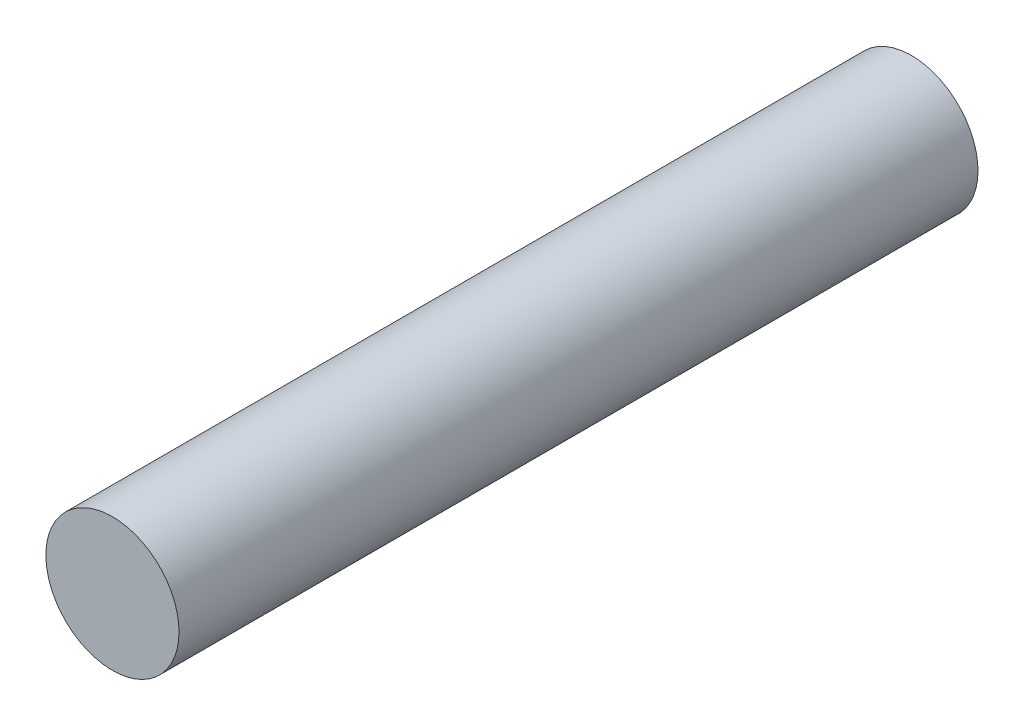
ISO-10303-21;
HEADER;
FILE_DESCRIPTION(('STEP AP214'),'2;1');
FILE_NAME('part.step','',(''),(''),'','','');
FILE_SCHEMA(('AUTOMOTIVE_DESIGN { 1 0 10303 214 1 1 1 1 }'));
ENDSEC;
DATA;
#1=APPLICATION_CONTEXT('core data for automotive mechanical design processes');
#2=APPLICATION_PROTOCOL_DEFINITION('international standard','automotive_design',2000,#1);
#3=PRODUCT_CONTEXT('',#1,'mechanical');
#4=PRODUCT('Part','Part','',(#3));
#5=PRODUCT_RELATED_PRODUCT_CATEGORY('part','',(#4));
#6=PRODUCT_DEFINITION_FORMATION('','',#4);
#7=PRODUCT_DEFINITION_CONTEXT('part definition',#1,'design');
#8=PRODUCT_DEFINITION('design','',#6,#7);
#9=PRODUCT_DEFINITION_SHAPE('','',#8);
#10=(LENGTH_UNIT() NAMED_UNIT(*) SI_UNIT(.MILLI.,.METRE.));
#11=(NAMED_UNIT(*) PLANE_ANGLE_UNIT() SI_UNIT($,.RADIAN.));
#12=(NAMED_UNIT(*) SI_UNIT($,.STERADIAN.) SOLID_ANGLE_UNIT());
#13=UNCERTAINTY_MEASURE_WITH_UNIT(LENGTH_MEASURE(1.E-05),#10,'distance_accuracy_value','');
#14=(GEOMETRIC_REPRESENTATION_CONTEXT(3) GLOBAL_UNCERTAINTY_ASSIGNED_CONTEXT((#13)) GLOBAL_UNIT_ASSIGNED_CONTEXT((#10,
#11,#12)) REPRESENTATION_CONTEXT('',''));
#15=CARTESIAN_POINT('',(0.,0.,0.));
#16=DIRECTION('',(0.,0.,1.));
#17=DIRECTION('',(1.,0.,0.));
#18=AXIS2_PLACEMENT_3D('',#15,#16,#17);
#19=CARTESIAN_POINT('',(0.,0.,24.));
#20=DIRECTION('',(0.,0.,-1.));
#21=DIRECTION('',(-1.,0.,0.));
#22=AXIS2_PLACEMENT_3D('',#19,#20,#21);
#23=CYLINDRICAL_SURFACE('',#22,2.);
#24=CARTESIAN_POINT('',(0.,0.,24.));
#25=DIRECTION('',(0.,0.,1.));
#26=DIRECTION('',(1.,0.,0.));
#27=AXIS2_PLACEMENT_3D('',#24,#25,#26);
#28=CIRCLE('',#27,2.);
#29=CARTESIAN_POINT('',(2.,0.,24.));
#30=VERTEX_POINT('',#29);
#31=EDGE_CURVE('E10',#30,#30,#28,.T.);
#32=ORIENTED_EDGE('',*,*,#31,.F.);
#33=EDGE_LOOP('',(#32));
#34=FACE_BOUND('',#33,.T.);
#35=CARTESIAN_POINT('',(0.,0.,0.));
#36=DIRECTION('',(0.,0.,1.));
#37=DIRECTION('',(1.,0.,0.));
#38=AXIS2_PLACEMENT_3D('',#35,#36,#37);
#39=CIRCLE('',#38,2.);
#40=CARTESIAN_POINT('',(2.,0.,0.));
#41=VERTEX_POINT('',#40);
#42=EDGE_CURVE('E33',#41,#41,#39,.T.);
#43=ORIENTED_EDGE('',*,*,#42,.T.);
#44=EDGE_LOOP('',(#43));
#45=FACE_BOUND('',#44,.T.);
#46=ADVANCED_FACE('F30',(#34,#45),#23,.T.);
#47=CARTESIAN_POINT('',(0.,0.,24.));
#48=DIRECTION('',(0.,0.,1.));
#49=DIRECTION('',(1.,0.,0.));
#50=AXIS2_PLACEMENT_3D('',#47,#48,#49);
#51=PLANE('',#50);
#52=ORIENTED_EDGE('',*,*,#31,.T.);
#53=EDGE_LOOP('',(#52));
#54=FACE_BOUND('',#53,.T.);
#55=ADVANCED_FACE('F45',(#54),#51,.T.);
#56=CARTESIAN_POINT('',(0.,0.,0.));
#57=DIRECTION('',(0.,0.,1.));
#58=DIRECTION('',(1.,0.,0.));
#59=AXIS2_PLACEMENT_3D('',#56,#57,#58);
#60=PLANE('',#59);
#61=ORIENTED_EDGE('',*,*,#42,.F.);
#62=EDGE_LOOP('',(#61));
#63=FACE_BOUND('',#62,.T.);
#64=ADVANCED_FACE('F43',(#63),#60,.F.);
#65=CLOSED_SHELL('',(#46,#55,#64));
#66=MANIFOLD_SOLID_BREP('B2',#65);
#67=ADVANCED_BREP_SHAPE_REPRESENTATION('',(#18,#66),#14);
#68=SHAPE_DEFINITION_REPRESENTATION(#9,#67);
ENDSEC;
END-ISO-10303-21;
